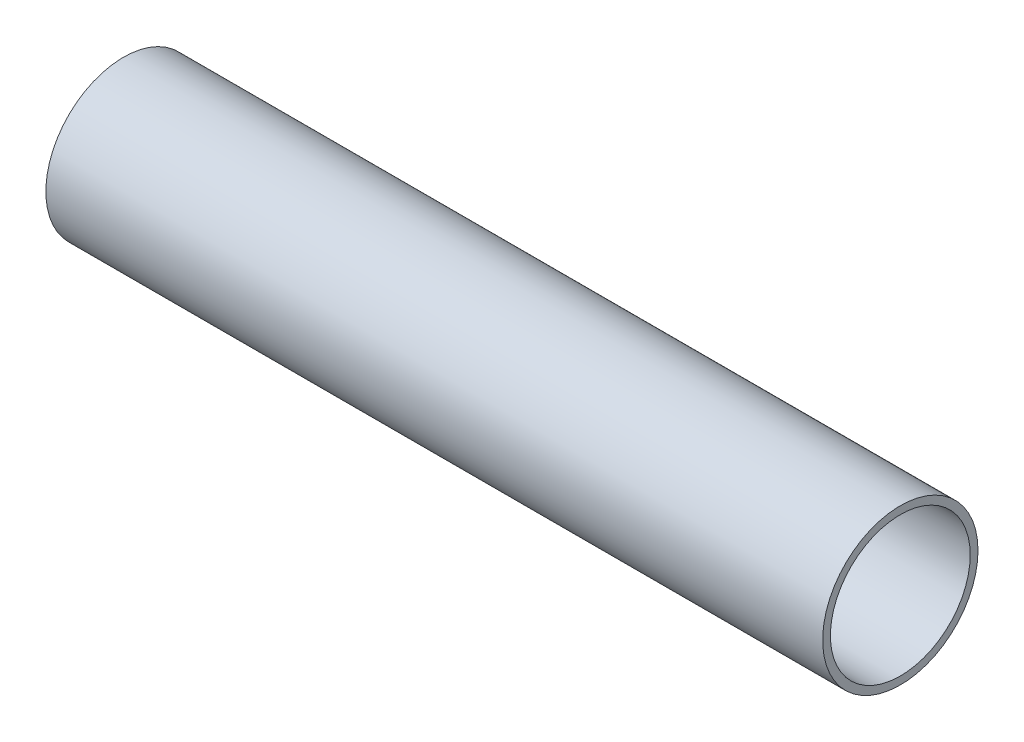
ISO-10303-21;
HEADER;
FILE_DESCRIPTION(('STEP AP214'),'2;1');
FILE_NAME('part.step','',(''),(''),'','','');
FILE_SCHEMA(('AUTOMOTIVE_DESIGN { 1 0 10303 214 1 1 1 1 }'));
ENDSEC;
DATA;
#1=APPLICATION_CONTEXT('core data for automotive mechanical design processes');
#2=APPLICATION_PROTOCOL_DEFINITION('international standard','automotive_design',2000,#1);
#3=PRODUCT_CONTEXT('',#1,'mechanical');
#4=PRODUCT('Part','Part','',(#3));
#5=PRODUCT_RELATED_PRODUCT_CATEGORY('part','',(#4));
#6=PRODUCT_DEFINITION_FORMATION('','',#4);
#7=PRODUCT_DEFINITION_CONTEXT('part definition',#1,'design');
#8=PRODUCT_DEFINITION('design','',#6,#7);
#9=PRODUCT_DEFINITION_SHAPE('','',#8);
#10=(LENGTH_UNIT() NAMED_UNIT(*) SI_UNIT(.MILLI.,.METRE.));
#11=(NAMED_UNIT(*) PLANE_ANGLE_UNIT() SI_UNIT($,.RADIAN.));
#12=(NAMED_UNIT(*) SI_UNIT($,.STERADIAN.) SOLID_ANGLE_UNIT());
#13=UNCERTAINTY_MEASURE_WITH_UNIT(LENGTH_MEASURE(1.E-05),#10,'distance_accuracy_value','');
#14=(GEOMETRIC_REPRESENTATION_CONTEXT(3) GLOBAL_UNCERTAINTY_ASSIGNED_CONTEXT((#13)) GLOBAL_UNIT_ASSIGNED_CONTEXT((#10,
#11,#12)) REPRESENTATION_CONTEXT('',''));
#15=CARTESIAN_POINT('',(0.,0.,0.));
#16=DIRECTION('',(0.,0.,1.));
#17=DIRECTION('',(1.,0.,0.));
#18=AXIS2_PLACEMENT_3D('',#15,#16,#17);
#19=CARTESIAN_POINT('',(200.,0.,0.));
#20=DIRECTION('',(1.,0.,0.));
#21=DIRECTION('',(0.,0.,-1.));
#22=AXIS2_PLACEMENT_3D('',#19,#20,#21);
#23=PLANE('',#22);
#24=CARTESIAN_POINT('',(200.,0.,0.));
#25=DIRECTION('',(1.,0.,0.));
#26=DIRECTION('',(0.,0.,-1.));
#27=AXIS2_PLACEMENT_3D('',#24,#25,#26);
#28=CIRCLE('',#27,20.);
#29=CARTESIAN_POINT('',(200.,0.,-20.));
#30=VERTEX_POINT('',#29);
#31=EDGE_CURVE('E10',#30,#30,#28,.T.);
#32=ORIENTED_EDGE('',*,*,#31,.T.);
#33=EDGE_LOOP('',(#32));
#34=FACE_BOUND('',#33,.T.);
#35=CARTESIAN_POINT('',(200.,0.,0.));
#36=DIRECTION('',(1.,0.,0.));
#37=DIRECTION('',(0.,0.,-1.));
#38=AXIS2_PLACEMENT_3D('',#35,#36,#37);
#39=CIRCLE('',#38,18.);
#40=CARTESIAN_POINT('',(200.,0.,-18.));
#41=VERTEX_POINT('',#40);
#42=EDGE_CURVE('E56',#41,#41,#39,.T.);
#43=ORIENTED_EDGE('',*,*,#42,.F.);
#44=EDGE_LOOP('',(#43));
#45=FACE_BOUND('',#44,.T.);
#46=ADVANCED_FACE('F43',(#34,#45),#23,.T.);
#47=CARTESIAN_POINT('',(0.,0.,0.));
#48=DIRECTION('',(1.,0.,0.));
#49=DIRECTION('',(0.,0.,-1.));
#50=AXIS2_PLACEMENT_3D('',#47,#48,#49);
#51=PLANE('',#50);
#52=CARTESIAN_POINT('',(0.,0.,0.));
#53=DIRECTION('',(1.,0.,0.));
#54=DIRECTION('',(0.,0.,-1.));
#55=AXIS2_PLACEMENT_3D('',#52,#53,#54);
#56=CIRCLE('',#55,20.);
#57=CARTESIAN_POINT('',(0.,0.,-20.));
#58=VERTEX_POINT('',#57);
#59=EDGE_CURVE('E47',#58,#58,#56,.T.);
#60=ORIENTED_EDGE('',*,*,#59,.F.);
#61=EDGE_LOOP('',(#60));
#62=FACE_BOUND('',#61,.T.);
#63=CARTESIAN_POINT('',(0.,0.,0.));
#64=DIRECTION('',(1.,0.,0.));
#65=DIRECTION('',(0.,0.,-1.));
#66=AXIS2_PLACEMENT_3D('',#63,#64,#65);
#67=CIRCLE('',#66,18.);
#68=CARTESIAN_POINT('',(0.,0.,-18.));
#69=VERTEX_POINT('',#68);
#70=EDGE_CURVE('E58',#69,#69,#67,.T.);
#71=ORIENTED_EDGE('',*,*,#70,.T.);
#72=EDGE_LOOP('',(#71));
#73=FACE_BOUND('',#72,.T.);
#74=ADVANCED_FACE('F70',(#62,#73),#51,.F.);
#75=CARTESIAN_POINT('',(200.,0.,0.));
#76=DIRECTION('',(-1.,0.,0.));
#77=DIRECTION('',(0.,0.,1.));
#78=AXIS2_PLACEMENT_3D('',#75,#76,#77);
#79=CYLINDRICAL_SURFACE('',#78,20.);
#80=ORIENTED_EDGE('',*,*,#31,.F.);
#81=EDGE_LOOP('',(#80));
#82=FACE_BOUND('',#81,.T.);
#83=ORIENTED_EDGE('',*,*,#59,.T.);
#84=EDGE_LOOP('',(#83));
#85=FACE_BOUND('',#84,.T.);
#86=ADVANCED_FACE('F45',(#82,#85),#79,.T.);
#87=CARTESIAN_POINT('',(200.,0.,0.));
#88=DIRECTION('',(-1.,0.,0.));
#89=DIRECTION('',(0.,0.,1.));
#90=AXIS2_PLACEMENT_3D('',#87,#88,#89);
#91=CYLINDRICAL_SURFACE('',#90,18.);
#92=ORIENTED_EDGE('',*,*,#42,.T.);
#93=EDGE_LOOP('',(#92));
#94=FACE_BOUND('',#93,.T.);
#95=ORIENTED_EDGE('',*,*,#70,.F.);
#96=EDGE_LOOP('',(#95));
#97=FACE_BOUND('',#96,.T.);
#98=ADVANCED_FACE('F66',(#94,#97),#91,.F.);
#99=CLOSED_SHELL('',(#46,#74,#86,#98));
#100=MANIFOLD_SOLID_BREP('B2',#99);
#101=ADVANCED_BREP_SHAPE_REPRESENTATION('',(#18,#100),#14);
#102=SHAPE_DEFINITION_REPRESENTATION(#9,#101);
ENDSEC;
END-ISO-10303-21;
